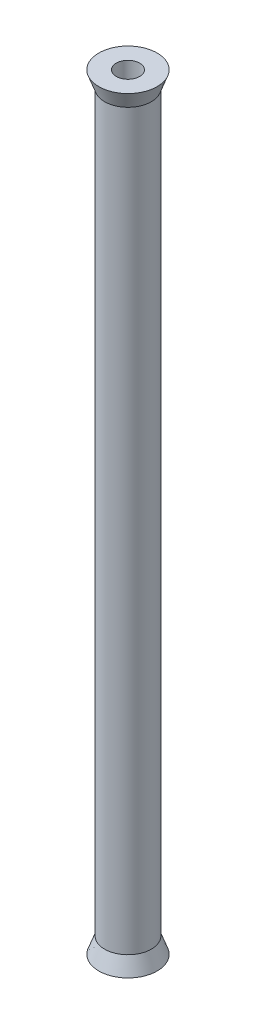
ISO-10303-21;
HEADER;
FILE_DESCRIPTION(('STEP AP214'),'2;1');
FILE_NAME('part.step','',(''),(''),'','','');
FILE_SCHEMA(('AUTOMOTIVE_DESIGN { 1 0 10303 214 1 1 1 1 }'));
ENDSEC;
DATA;
#1=APPLICATION_CONTEXT('core data for automotive mechanical design processes');
#2=APPLICATION_PROTOCOL_DEFINITION('international standard','automotive_design',2000,#1);
#3=PRODUCT_CONTEXT('',#1,'mechanical');
#4=PRODUCT('Part','Part','',(#3));
#5=PRODUCT_RELATED_PRODUCT_CATEGORY('part','',(#4));
#6=PRODUCT_DEFINITION_FORMATION('','',#4);
#7=PRODUCT_DEFINITION_CONTEXT('part definition',#1,'design');
#8=PRODUCT_DEFINITION('design','',#6,#7);
#9=PRODUCT_DEFINITION_SHAPE('','',#8);
#10=(LENGTH_UNIT() NAMED_UNIT(*) SI_UNIT(.MILLI.,.METRE.));
#11=(NAMED_UNIT(*) PLANE_ANGLE_UNIT() SI_UNIT($,.RADIAN.));
#12=(NAMED_UNIT(*) SI_UNIT($,.STERADIAN.) SOLID_ANGLE_UNIT());
#13=UNCERTAINTY_MEASURE_WITH_UNIT(LENGTH_MEASURE(1.E-05),#10,'distance_accuracy_value','');
#14=(GEOMETRIC_REPRESENTATION_CONTEXT(3) GLOBAL_UNCERTAINTY_ASSIGNED_CONTEXT((#13)) GLOBAL_UNIT_ASSIGNED_CONTEXT((#10,
#11,#12)) REPRESENTATION_CONTEXT('',''));
#15=CARTESIAN_POINT('',(0.,0.,0.));
#16=DIRECTION('',(0.,0.,1.));
#17=DIRECTION('',(1.,0.,0.));
#18=AXIS2_PLACEMENT_3D('',#15,#16,#17);
#19=CARTESIAN_POINT('',(0.,62.9525225805455,0.));
#20=DIRECTION('',(0.,1.,0.));
#21=DIRECTION('',(0.,0.,1.));
#22=AXIS2_PLACEMENT_3D('',#19,#20,#21);
#23=CONICAL_SURFACE('',#22,4.00000000000001,0.349065850398869);
#24=CARTESIAN_POINT('',(0.,65.7,0.));
#25=DIRECTION('',(0.,1.,0.));
#26=DIRECTION('',(0.,0.,1.));
#27=AXIS2_PLACEMENT_3D('',#24,#25,#26);
#28=CIRCLE('',#27,4.99999999999999);
#29=CARTESIAN_POINT('',(0.,65.7,4.99999999999999));
#30=VERTEX_POINT('',#29);
#31=EDGE_CURVE('E10',#30,#30,#28,.T.);
#32=ORIENTED_EDGE('',*,*,#31,.F.);
#33=EDGE_LOOP('',(#32));
#34=FACE_BOUND('',#33,.T.);
#35=CARTESIAN_POINT('',(0.,62.9525225805455,0.));
#36=DIRECTION('',(0.,1.,0.));
#37=DIRECTION('',(0.,0.,1.));
#38=AXIS2_PLACEMENT_3D('',#35,#36,#37);
#39=CIRCLE('',#38,4.00000000000001);
#40=CARTESIAN_POINT('',(0.,62.9525225805455,4.00000000000001));
#41=VERTEX_POINT('',#40);
#42=EDGE_CURVE('E63',#41,#41,#39,.T.);
#43=ORIENTED_EDGE('',*,*,#42,.T.);
#44=EDGE_LOOP('',(#43));
#45=FACE_BOUND('',#44,.T.);
#46=ADVANCED_FACE('F41',(#34,#45),#23,.T.);
#47=CARTESIAN_POINT('',(2.00000000000001,65.7,0.));
#48=DIRECTION('',(0.,-1.,0.));
#49=DIRECTION('',(0.,0.,-1.));
#50=AXIS2_PLACEMENT_3D('',#47,#48,#49);
#51=PLANE('',#50);
#52=CARTESIAN_POINT('',(0.,65.7,0.));
#53=DIRECTION('',(0.,1.,0.));
#54=DIRECTION('',(0.,0.,1.));
#55=AXIS2_PLACEMENT_3D('',#52,#53,#54);
#56=CIRCLE('',#55,2.00000000000001);
#57=CARTESIAN_POINT('',(0.,65.7,2.00000000000001));
#58=VERTEX_POINT('',#57);
#59=EDGE_CURVE('E47',#58,#58,#56,.T.);
#60=ORIENTED_EDGE('',*,*,#59,.F.);
#61=EDGE_LOOP('',(#60));
#62=FACE_BOUND('',#61,.T.);
#63=ORIENTED_EDGE('',*,*,#31,.T.);
#64=EDGE_LOOP('',(#63));
#65=FACE_BOUND('',#64,.T.);
#66=ADVANCED_FACE('F88',(#62,#65),#51,.F.);
#67=CARTESIAN_POINT('',(0.,0.,0.));
#68=DIRECTION('',(0.,1.,0.));
#69=DIRECTION('',(0.,0.,1.));
#70=AXIS2_PLACEMENT_3D('',#67,#68,#69);
#71=CYLINDRICAL_SURFACE('',#70,2.00000000000001);
#72=CARTESIAN_POINT('',(0.,-65.7,0.));
#73=DIRECTION('',(0.,1.,0.));
#74=DIRECTION('',(0.,0.,1.));
#75=AXIS2_PLACEMENT_3D('',#72,#73,#74);
#76=CIRCLE('',#75,2.00000000000001);
#77=CARTESIAN_POINT('',(0.,-65.7,2.00000000000001));
#78=VERTEX_POINT('',#77);
#79=EDGE_CURVE('E51',#78,#78,#76,.T.);
#80=ORIENTED_EDGE('',*,*,#79,.F.);
#81=EDGE_LOOP('',(#80));
#82=FACE_BOUND('',#81,.T.);
#83=ORIENTED_EDGE('',*,*,#59,.T.);
#84=EDGE_LOOP('',(#83));
#85=FACE_BOUND('',#84,.T.);
#86=ADVANCED_FACE('F83',(#82,#85),#71,.F.);
#87=CARTESIAN_POINT('',(2.00000000000001,-65.7,0.));
#88=DIRECTION('',(0.,1.,0.));
#89=DIRECTION('',(0.,0.,1.));
#90=AXIS2_PLACEMENT_3D('',#87,#88,#89);
#91=PLANE('',#90);
#92=CARTESIAN_POINT('',(0.,-65.7,0.));
#93=DIRECTION('',(0.,1.,0.));
#94=DIRECTION('',(0.,0.,1.));
#95=AXIS2_PLACEMENT_3D('',#92,#93,#94);
#96=CIRCLE('',#95,4.99999999999999);
#97=CARTESIAN_POINT('',(0.,-65.7,4.99999999999999));
#98=VERTEX_POINT('',#97);
#99=EDGE_CURVE('E55',#98,#98,#96,.T.);
#100=ORIENTED_EDGE('',*,*,#99,.F.);
#101=EDGE_LOOP('',(#100));
#102=FACE_BOUND('',#101,.T.);
#103=ORIENTED_EDGE('',*,*,#79,.T.);
#104=EDGE_LOOP('',(#103));
#105=FACE_BOUND('',#104,.T.);
#106=ADVANCED_FACE('F77',(#102,#105),#91,.F.);
#107=CARTESIAN_POINT('',(0.,-65.7,0.));
#108=DIRECTION('',(0.,-1.,0.));
#109=DIRECTION('',(0.,0.,-1.));
#110=AXIS2_PLACEMENT_3D('',#107,#108,#109);
#111=CONICAL_SURFACE('',#110,4.99999999999999,0.349065850398869);
#112=CARTESIAN_POINT('',(0.,-62.9525225805455,0.));
#113=DIRECTION('',(0.,1.,0.));
#114=DIRECTION('',(0.,0.,1.));
#115=AXIS2_PLACEMENT_3D('',#112,#113,#114);
#116=CIRCLE('',#115,4.00000000000001);
#117=CARTESIAN_POINT('',(0.,-62.9525225805455,4.00000000000001));
#118=VERTEX_POINT('',#117);
#119=EDGE_CURVE('E60',#118,#118,#116,.T.);
#120=ORIENTED_EDGE('',*,*,#119,.F.);
#121=EDGE_LOOP('',(#120));
#122=FACE_BOUND('',#121,.T.);
#123=ORIENTED_EDGE('',*,*,#99,.T.);
#124=EDGE_LOOP('',(#123));
#125=FACE_BOUND('',#124,.T.);
#126=ADVANCED_FACE('F71',(#122,#125),#111,.T.);
#127=CARTESIAN_POINT('',(0.,0.,0.));
#128=DIRECTION('',(0.,1.,0.));
#129=DIRECTION('',(0.,0.,1.));
#130=AXIS2_PLACEMENT_3D('',#127,#128,#129);
#131=CYLINDRICAL_SURFACE('',#130,4.00000000000001);
#132=ORIENTED_EDGE('',*,*,#42,.F.);
#133=EDGE_LOOP('',(#132));
#134=FACE_BOUND('',#133,.T.);
#135=ORIENTED_EDGE('',*,*,#119,.T.);
#136=EDGE_LOOP('',(#135));
#137=FACE_BOUND('',#136,.T.);
#138=ADVANCED_FACE('F68',(#134,#137),#131,.T.);
#139=CLOSED_SHELL('',(#46,#66,#86,#106,#126,#138));
#140=MANIFOLD_SOLID_BREP('B2',#139);
#141=ADVANCED_BREP_SHAPE_REPRESENTATION('',(#18,#140),#14);
#142=SHAPE_DEFINITION_REPRESENTATION(#9,#141);
ENDSEC;
END-ISO-10303-21;
